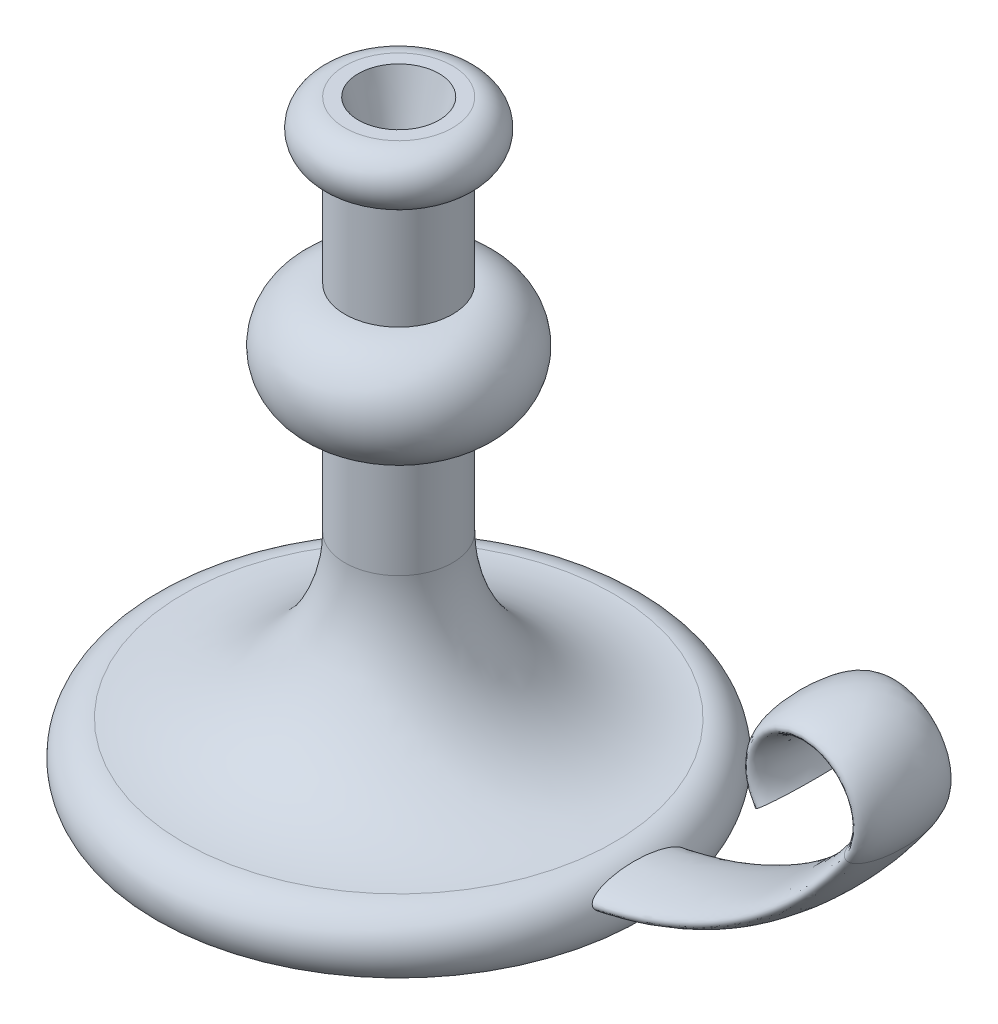
ISO-10303-21;
HEADER;
FILE_DESCRIPTION(('STEP AP214'),'2;1');
FILE_NAME('part.step','',(''),(''),'','','');
FILE_SCHEMA(('AUTOMOTIVE_DESIGN { 1 0 10303 214 1 1 1 1 }'));
ENDSEC;
DATA;
#1=APPLICATION_CONTEXT('core data for automotive mechanical design processes');
#2=APPLICATION_PROTOCOL_DEFINITION('international standard','automotive_design',2000,#1);
#3=PRODUCT_CONTEXT('',#1,'mechanical');
#4=PRODUCT('Part','Part','',(#3));
#5=PRODUCT_RELATED_PRODUCT_CATEGORY('part','',(#4));
#6=PRODUCT_DEFINITION_FORMATION('','',#4);
#7=PRODUCT_DEFINITION_CONTEXT('part definition',#1,'design');
#8=PRODUCT_DEFINITION('design','',#6,#7);
#9=PRODUCT_DEFINITION_SHAPE('','',#8);
#10=(LENGTH_UNIT() NAMED_UNIT(*) SI_UNIT(.MILLI.,.METRE.));
#11=(NAMED_UNIT(*) PLANE_ANGLE_UNIT() SI_UNIT($,.RADIAN.));
#12=(NAMED_UNIT(*) SI_UNIT($,.STERADIAN.) SOLID_ANGLE_UNIT());
#13=UNCERTAINTY_MEASURE_WITH_UNIT(LENGTH_MEASURE(1.E-05),#10,'distance_accuracy_value','');
#14=(GEOMETRIC_REPRESENTATION_CONTEXT(3) GLOBAL_UNCERTAINTY_ASSIGNED_CONTEXT((#13)) GLOBAL_UNIT_ASSIGNED_CONTEXT((#10,
#11,#12)) REPRESENTATION_CONTEXT('',''));
#15=CARTESIAN_POINT('',(0.,0.,0.));
#16=DIRECTION('',(0.,0.,1.));
#17=DIRECTION('',(1.,0.,0.));
#18=AXIS2_PLACEMENT_3D('',#15,#16,#17);
#19=CARTESIAN_POINT('',(0.,0.,0.));
#20=DIRECTION('',(0.,-1.,0.));
#21=DIRECTION('',(0.,0.,-1.));
#22=AXIS2_PLACEMENT_3D('',#19,#20,#21);
#23=PLANE('',#22);
#24=CARTESIAN_POINT('',(0.,0.,0.));
#25=DIRECTION('',(0.,-1.,0.));
#26=DIRECTION('',(0.,0.,-1.));
#27=AXIS2_PLACEMENT_3D('',#24,#25,#26);
#28=CIRCLE('',#27,90.);
#29=CARTESIAN_POINT('',(0.,0.,-90.));
#30=VERTEX_POINT('',#29);
#31=EDGE_CURVE('E77',#30,#30,#28,.T.);
#32=ORIENTED_EDGE('',*,*,#31,.T.);
#33=EDGE_LOOP('',(#32));
#34=FACE_BOUND('',#33,.T.);
#35=ADVANCED_FACE('F37',(#34),#23,.T.);
#36=CARTESIAN_POINT('',(0.,220.,0.));
#37=DIRECTION('',(0.,1.,0.));
#38=DIRECTION('',(0.,0.,1.));
#39=AXIS2_PLACEMENT_3D('',#36,#37,#38);
#40=PLANE('',#39);
#41=CARTESIAN_POINT('',(0.,220.,0.));
#42=DIRECTION('',(0.,1.,0.));
#43=DIRECTION('',(0.,0.,1.));
#44=AXIS2_PLACEMENT_3D('',#41,#42,#43);
#45=CIRCLE('',#44,15.);
#46=CARTESIAN_POINT('',(0.,220.,15.));
#47=VERTEX_POINT('',#46);
#48=EDGE_CURVE('E93',#47,#47,#45,.T.);
#49=ORIENTED_EDGE('',*,*,#48,.F.);
#50=EDGE_LOOP('',(#49));
#51=FACE_BOUND('',#50,.T.);
#52=CARTESIAN_POINT('',(0.,220.,0.));
#53=DIRECTION('',(0.,-1.,0.));
#54=DIRECTION('',(0.,0.,-1.));
#55=AXIS2_PLACEMENT_3D('',#52,#53,#54);
#56=CIRCLE('',#55,20.);
#57=CARTESIAN_POINT('',(0.,220.,-20.));
#58=VERTEX_POINT('',#57);
#59=EDGE_CURVE('E49',#58,#58,#56,.T.);
#60=ORIENTED_EDGE('',*,*,#59,.F.);
#61=EDGE_LOOP('',(#60));
#62=FACE_BOUND('',#61,.T.);
#63=ADVANCED_FACE('F100',(#51,#62),#40,.T.);
#64=CARTESIAN_POINT('',(0.,210.,0.));
#65=DIRECTION('',(0.,-1.,0.));
#66=DIRECTION('',(0.,0.,-1.));
#67=AXIS2_PLACEMENT_3D('',#64,#65,#66);
#68=TOROIDAL_SURFACE('',#67,20.,10.);
#69=ORIENTED_EDGE('',*,*,#59,.T.);
#70=EDGE_LOOP('',(#69));
#71=FACE_BOUND('',#70,.T.);
#72=CARTESIAN_POINT('',(0.,200.,0.));
#73=DIRECTION('',(0.,-1.,0.));
#74=DIRECTION('',(0.,0.,-1.));
#75=AXIS2_PLACEMENT_3D('',#72,#73,#74);
#76=CIRCLE('',#75,20.);
#77=CARTESIAN_POINT('',(0.,200.,-20.));
#78=VERTEX_POINT('',#77);
#79=EDGE_CURVE('E54',#78,#78,#76,.T.);
#80=ORIENTED_EDGE('',*,*,#79,.F.);
#81=EDGE_LOOP('',(#80));
#82=FACE_BOUND('',#81,.T.);
#83=ADVANCED_FACE('F103',(#71,#82),#68,.T.);
#84=CARTESIAN_POINT('',(0.,0.,0.));
#85=DIRECTION('',(0.,-1.,0.));
#86=DIRECTION('',(0.,0.,-1.));
#87=AXIS2_PLACEMENT_3D('',#84,#85,#86);
#88=CYLINDRICAL_SURFACE('',#87,20.);
#89=ORIENTED_EDGE('',*,*,#79,.T.);
#90=EDGE_LOOP('',(#89));
#91=FACE_BOUND('',#90,.T.);
#92=CARTESIAN_POINT('',(0.,160.,0.));
#93=DIRECTION('',(0.,-1.,0.));
#94=DIRECTION('',(0.,0.,-1.));
#95=AXIS2_PLACEMENT_3D('',#92,#93,#94);
#96=CIRCLE('',#95,20.);
#97=CARTESIAN_POINT('',(0.,160.,-20.));
#98=VERTEX_POINT('',#97);
#99=EDGE_CURVE('E59',#98,#98,#96,.T.);
#100=ORIENTED_EDGE('',*,*,#99,.F.);
#101=EDGE_LOOP('',(#100));
#102=FACE_BOUND('',#101,.T.);
#103=ADVANCED_FACE('F109',(#91,#102),#88,.T.);
#104=CARTESIAN_POINT('',(0.,140.,0.));
#105=DIRECTION('',(0.,-1.,0.));
#106=DIRECTION('',(0.,0.,-1.));
#107=AXIS2_PLACEMENT_3D('',#104,#105,#106);
#108=TOROIDAL_SURFACE('',#107,20.,20.);
#109=ORIENTED_EDGE('',*,*,#99,.T.);
#110=EDGE_LOOP('',(#109));
#111=FACE_BOUND('',#110,.T.);
#112=CARTESIAN_POINT('',(0.,120.,0.));
#113=DIRECTION('',(0.,-1.,0.));
#114=DIRECTION('',(0.,0.,-1.));
#115=AXIS2_PLACEMENT_3D('',#112,#113,#114);
#116=CIRCLE('',#115,20.);
#117=CARTESIAN_POINT('',(0.,120.,-20.));
#118=VERTEX_POINT('',#117);
#119=EDGE_CURVE('E65',#118,#118,#116,.T.);
#120=ORIENTED_EDGE('',*,*,#119,.F.);
#121=EDGE_LOOP('',(#120));
#122=FACE_BOUND('',#121,.T.);
#123=ADVANCED_FACE('F116',(#111,#122),#108,.T.);
#124=CARTESIAN_POINT('',(0.,0.,0.));
#125=DIRECTION('',(0.,-1.,0.));
#126=DIRECTION('',(0.,0.,-1.));
#127=AXIS2_PLACEMENT_3D('',#124,#125,#126);
#128=CYLINDRICAL_SURFACE('',#127,20.);
#129=ORIENTED_EDGE('',*,*,#119,.T.);
#130=EDGE_LOOP('',(#129));
#131=FACE_BOUND('',#130,.T.);
#132=CARTESIAN_POINT('',(0.,80.,0.));
#133=DIRECTION('',(0.,-1.,0.));
#134=DIRECTION('',(0.,0.,-1.));
#135=AXIS2_PLACEMENT_3D('',#132,#133,#134);
#136=CIRCLE('',#135,20.);
#137=CARTESIAN_POINT('',(0.,80.,-20.));
#138=VERTEX_POINT('',#137);
#139=EDGE_CURVE('E69',#138,#138,#136,.T.);
#140=ORIENTED_EDGE('',*,*,#139,.F.);
#141=EDGE_LOOP('',(#140));
#142=FACE_BOUND('',#141,.T.);
#143=ADVANCED_FACE('F120',(#131,#142),#128,.T.);
#144=CARTESIAN_POINT('',(0.,80.,0.));
#145=DIRECTION('',(0.,-1.,0.));
#146=DIRECTION('',(0.,0.,-1.));
#147=AXIS2_PLACEMENT_3D('',#144,#145,#146);
#148=TOROIDAL_SURFACE('',#147,80.,60.);
#149=ORIENTED_EDGE('',*,*,#139,.T.);
#150=EDGE_LOOP('',(#149));
#151=FACE_BOUND('',#150,.T.);
#152=CARTESIAN_POINT('',(0.,20.,0.));
#153=DIRECTION('',(0.,-1.,0.));
#154=DIRECTION('',(0.,0.,-1.));
#155=AXIS2_PLACEMENT_3D('',#152,#153,#154);
#156=CIRCLE('',#155,80.);
#157=CARTESIAN_POINT('',(0.,20.,-80.));
#158=VERTEX_POINT('',#157);
#159=EDGE_CURVE('E73',#158,#158,#156,.T.);
#160=ORIENTED_EDGE('',*,*,#159,.F.);
#161=EDGE_LOOP('',(#160));
#162=FACE_BOUND('',#161,.T.);
#163=ADVANCED_FACE('F124',(#151,#162),#148,.F.);
#164=CARTESIAN_POINT('',(0.,7.49999999999999,0.));
#165=DIRECTION('',(0.,-1.,0.));
#166=DIRECTION('',(0.,0.,-1.));
#167=AXIS2_PLACEMENT_3D('',#164,#165,#166);
#168=TOROIDAL_SURFACE('',#167,80.,12.5);
#169=CARTESIAN_POINT('',(89.5597422043341,12.9414346567555,-17.5));
#170=CARTESIAN_POINT('',(89.5390618403561,12.9834100865229,-17.4999996776707));
#171=CARTESIAN_POINT('',(89.5184817634659,13.0254349004937,-17.4978446678338));
#172=CARTESIAN_POINT('',(89.4776811982743,13.1092324497794,-17.4892861575811));
#173=CARTESIAN_POINT('',(89.457460843071,13.1510050881611,-17.482881116885));
#174=CARTESIAN_POINT('',(89.397540281121,13.2754779151414,-17.4575154450277));
#175=CARTESIAN_POINT('',(89.3585808220613,13.357332519418,-17.4324042670615));
#176=CARTESIAN_POINT('',(89.2734407804368,13.5379179993389,-17.3597430943198));
#177=CARTESIAN_POINT('',(89.2281116968574,13.6353152430682,-17.3079906529225));
#178=CARTESIAN_POINT('',(89.1421567137609,13.8217570109409,-17.1881654215547));
#179=CARTESIAN_POINT('',(89.10154096816,13.9107834263932,-17.1200583326704));
#180=CARTESIAN_POINT('',(89.0298799325304,14.0690063055582,-16.9825317839868));
#181=CARTESIAN_POINT('',(88.9982856031081,14.1392491335227,-16.9145677994464));
#182=CARTESIAN_POINT('',(88.9378435588022,14.2742914925202,-16.7722502997375));
#183=CARTESIAN_POINT('',(88.9089980734781,14.3390866000317,-16.6978916893925));
#184=CARTESIAN_POINT('',(88.8536099995593,14.4639626152392,-16.5442177801531));
#185=CARTESIAN_POINT('',(88.8270733532936,14.5240313225779,-16.4648905452803));
#186=CARTESIAN_POINT('',(88.7760376587063,14.6398576639347,-16.3025863942461));
#187=CARTESIAN_POINT('',(88.7515379613228,14.6956166708123,-16.219610653644));
#188=CARTESIAN_POINT('',(88.7047328205489,14.8023169553036,-16.052427362784));
#189=CARTESIAN_POINT('',(88.6823939519366,14.8533308765833,-15.9682752160745));
#190=CARTESIAN_POINT('',(88.639155365759,14.9521540950118,-15.7977416210759));
#191=CARTESIAN_POINT('',(88.6182558899721,14.9999628537458,-15.711359801597));
#192=CARTESIAN_POINT('',(88.5573681790008,15.1392585624723,-15.4492483073625));
#193=CARTESIAN_POINT('',(88.5192579811327,15.2264609786255,-15.2707999543232));
#194=CARTESIAN_POINT('',(88.4468979005836,15.3916731276291,-14.9088289385944));
#195=CARTESIAN_POINT('',(88.4126513155026,15.4696750103546,-14.725302105289));
#196=CARTESIAN_POINT('',(88.3471391595039,15.6182965032923,-14.3538259785736));
#197=CARTESIAN_POINT('',(88.3158872528146,15.6888824046966,-14.1658608782527));
#198=CARTESIAN_POINT('',(88.2560127035516,15.8233792512431,-13.7874003918539));
#199=CARTESIAN_POINT('',(88.2273872233002,15.8872974109117,-13.5969079973402));
#200=CARTESIAN_POINT('',(88.1723348827448,16.0094159388249,-13.213849673779));
#201=CARTESIAN_POINT('',(88.1459074726896,16.0676177374301,-13.021284276893));
#202=CARTESIAN_POINT('',(88.0884248304702,16.1932687928886,-12.5849658119247));
#203=CARTESIAN_POINT('',(88.0579162002184,16.2592725226906,-12.3407253521734));
#204=CARTESIAN_POINT('',(87.9994625659013,16.3844358500305,-11.8501803460781));
#205=CARTESIAN_POINT('',(87.9715178234088,16.4435947494061,-11.6038755919222));
#206=CARTESIAN_POINT('',(87.9178897421858,16.5558889779776,-11.1095299870479));
#207=CARTESIAN_POINT('',(87.8922075114269,16.6090213595568,-10.8614883492399));
#208=CARTESIAN_POINT('',(87.8429155378603,16.7098546386226,-10.3640943607017));
#209=CARTESIAN_POINT('',(87.8193058942812,16.7575552760879,-10.114741947821));
#210=CARTESIAN_POINT('',(87.7514718906047,16.8930622945828,-9.36631396644898));
#211=CARTESIAN_POINT('',(87.710111419914,16.97354616682,-8.86564202060312));
#212=CARTESIAN_POINT('',(87.6344118706353,17.1178657179368,-7.86153551840227));
#213=CARTESIAN_POINT('',(87.6000713341079,17.1817048544489,-7.35810155802563));
#214=CARTESIAN_POINT('',(87.5383679228554,17.2943697092708,-6.35225136111873));
#215=CARTESIAN_POINT('',(87.5109639050818,17.3432843238913,-5.84984753787555));
#216=CARTESIAN_POINT('',(87.4628391630611,17.4279603163538,-4.84354228831009));
#217=CARTESIAN_POINT('',(87.4421195253372,17.4637195559667,-4.33964063194089));
#218=CARTESIAN_POINT('',(87.4074386787954,17.5229738360405,-3.33084363886012));
#219=CARTESIAN_POINT('',(87.3934780874881,17.5464677559495,-2.8259482155868));
#220=CARTESIAN_POINT('',(87.3724154174235,17.5817273168609,-1.81615213380802));
#221=CARTESIAN_POINT('',(87.3653059747339,17.5935055508652,-1.31125206554519));
#222=CARTESIAN_POINT('',(87.3579750479624,17.6056484066489,-0.301318309132898));
#223=CARTESIAN_POINT('',(87.357752858235,17.6060141977103,0.203715360026102));
#224=CARTESIAN_POINT('',(87.3641963426438,17.5953454261038,1.2135672655417));
#225=CARTESIAN_POINT('',(87.3708612610896,17.5843121142068,1.7183855194551));
#226=CARTESIAN_POINT('',(87.3886163883338,17.554616306541,2.60695068649854));
#227=CARTESIAN_POINT('',(87.3982690399213,17.5384060734754,2.9908104647884));
#228=CARTESIAN_POINT('',(87.4214966880659,17.4990063104014,3.75807002785712));
#229=CARTESIAN_POINT('',(87.435071823598,17.4758165331044,4.14146979585428));
#230=CARTESIAN_POINT('',(87.4661109016121,17.4221255760208,4.90767543763209));
#231=CARTESIAN_POINT('',(87.4835755913649,17.3916229911934,5.29048118303759));
#232=CARTESIAN_POINT('',(87.52247652696,17.3226675403927,6.05728766608036));
#233=CARTESIAN_POINT('',(87.5439339089184,17.2841722314846,6.44128353835441));
#234=CARTESIAN_POINT('',(87.5907685418077,17.1987228636429,7.20803081067556));
#235=CARTESIAN_POINT('',(87.6161451191905,17.1517702579396,7.5907824130423));
#236=CARTESIAN_POINT('',(87.6708875244928,17.0486132676472,8.35453102594114));
#237=CARTESIAN_POINT('',(87.7002509792863,16.9924143825779,8.73552894189135));
#238=CARTESIAN_POINT('',(87.7555693385741,16.8844873931684,9.40362807317344));
#239=CARTESIAN_POINT('',(87.7806318626291,16.8349635590468,9.6911595586556));
#240=CARTESIAN_POINT('',(87.8333287645207,16.7293167465828,10.2648242071223));
#241=CARTESIAN_POINT('',(87.8609635304672,16.6731927720484,10.5509571522122));
#242=CARTESIAN_POINT('',(87.9190678138249,16.5534902310351,11.1217112831612));
#243=CARTESIAN_POINT('',(87.9495404231884,16.4899035134826,11.4063304543324));
#244=CARTESIAN_POINT('',(88.0137266324375,16.3541216812727,11.9738772339476));
#245=CARTESIAN_POINT('',(88.0474477220507,16.2819065762202,12.2567992545898));
#246=CARTESIAN_POINT('',(88.1183718381953,16.1280994435204,12.8175821097588));
#247=CARTESIAN_POINT('',(88.1555499028383,16.046573796357,13.0954641920682));
#248=CARTESIAN_POINT('',(88.2343580118385,15.8719007074313,13.6468218234687));
#249=CARTESIAN_POINT('',(88.2759857295858,15.7787593350285,13.9202995902182));
#250=CARTESIAN_POINT('',(88.3426568223939,15.628384040649,14.3254052817092));
#251=CARTESIAN_POINT('',(88.3655500017785,15.5765627213432,14.459402316928));
#252=CARTESIAN_POINT('',(88.4129882653633,15.4688611687535,14.7254525655375));
#253=CARTESIAN_POINT('',(88.437533168995,15.4129813790936,14.8575059894887));
#254=CARTESIAN_POINT('',(88.4884967907572,15.296726972035,15.1188747284343));
#255=CARTESIAN_POINT('',(88.5149109123158,15.2363633637366,15.2481958098579));
#256=CARTESIAN_POINT('',(88.5700241751771,15.1103179001212,15.5037035642081));
#257=CARTESIAN_POINT('',(88.5987227483177,15.0446373670989,15.6298910063173));
#258=CARTESIAN_POINT('',(88.6570151826478,14.9113179601609,15.8704199707059));
#259=CARTESIAN_POINT('',(88.686441736786,14.8440563407289,15.985009599526));
#260=CARTESIAN_POINT('',(88.7482816567768,14.7030103830827,16.2094581395952));
#261=CARTESIAN_POINT('',(88.7806974756141,14.6292206899981,16.3193130551169));
#262=CARTESIAN_POINT('',(88.8489097184972,14.4745639616531,16.5315146626623));
#263=CARTESIAN_POINT('',(88.8846785573508,14.3937550191611,16.6339121024916));
#264=CARTESIAN_POINT('',(88.9606113704153,14.2232561160767,16.8291907541922));
#265=CARTESIAN_POINT('',(89.0007675950253,14.1335818404865,16.9220882016582));
#266=CARTESIAN_POINT('',(89.0601235459873,14.0021924630805,17.0411637727684));
#267=CARTESIAN_POINT('',(89.0770574086405,13.9648250339927,17.0732949178269));
#268=CARTESIAN_POINT('',(89.1117704043089,13.8885105828123,17.1351129203988));
#269=CARTESIAN_POINT('',(89.1295494801998,13.8495636674962,17.1647999427301));
#270=CARTESIAN_POINT('',(89.1842722230347,13.7301865324198,17.2496672583031));
#271=CARTESIAN_POINT('',(89.2225929343975,13.6472387371287,17.3006362954167));
#272=CARTESIAN_POINT('',(89.2830198855204,13.5177923286577,17.3659392171784));
#273=CARTESIAN_POINT('',(89.3038035106325,13.4734899832391,17.385944655127));
#274=CARTESIAN_POINT('',(89.346235727213,13.3835498526412,17.421521231844));
#275=CARTESIAN_POINT('',(89.3678838017236,13.3379128698458,17.4370949768747));
#276=CARTESIAN_POINT('',(89.411904802424,13.2456714845448,17.4633118273199));
#277=CARTESIAN_POINT('',(89.4342765183816,13.1990687398024,17.4739627514632));
#278=CARTESIAN_POINT('',(89.4796070415906,13.1052444737537,17.4900003628641));
#279=CARTESIAN_POINT('',(89.5025657624808,13.0580230439623,17.495387819971));
#280=CARTESIAN_POINT('',(89.5464271716018,12.9684112208445,17.5004320668286));
#281=CARTESIAN_POINT('',(89.5672934245651,12.9260327119426,17.5006298436876));
#282=CARTESIAN_POINT('',(89.6091580078856,12.8415284156484,17.496667300483));
#283=CARTESIAN_POINT('',(89.6301563797468,12.7994027167221,17.4925055351934));
#284=CARTESIAN_POINT('',(89.672115635143,12.7157496198108,17.479965082583));
#285=CARTESIAN_POINT('',(89.6930765014329,12.6742224548789,17.4715847960014));
#286=CARTESIAN_POINT('',(89.7348115258834,12.5920532516239,17.4508625220261));
#287=CARTESIAN_POINT('',(89.755585576578,12.5514117057388,17.4385183877269));
#288=CARTESIAN_POINT('',(89.8013847331776,12.4623676182577,17.407062698976));
#289=CARTESIAN_POINT('',(89.8263321178974,12.4142402057079,17.3870577635768));
#290=CARTESIAN_POINT('',(89.8756026524762,12.319894282953,17.3423007335128));
#291=CARTESIAN_POINT('',(89.8999253272692,12.2736772101064,17.317545140678));
#292=CARTESIAN_POINT('',(89.9718636752115,12.1379719567039,17.2371059859825));
#293=CARTESIAN_POINT('',(90.0184026508768,12.051520920799,17.1752845379973));
#294=CARTESIAN_POINT('',(90.1015176697338,11.8991704299987,17.0502729237445));
#295=CARTESIAN_POINT('',(90.1385373685485,11.832138329749,16.9886971231214));
#296=CARTESIAN_POINT('',(90.2104869329279,11.7032426034952,16.8591573255863));
#297=CARTESIAN_POINT('',(90.2454151408799,11.641383062009,16.7911883686367));
#298=CARTESIAN_POINT('',(90.3133841124365,11.5222099067343,16.6502911436158));
#299=CARTESIAN_POINT('',(90.3464212107125,11.4649050425001,16.5773538074551));
#300=CARTESIAN_POINT('',(90.4107258034174,11.3544143267813,16.427734996584));
#301=CARTESIAN_POINT('',(90.4419937497578,11.3012274221163,16.3510544874358));
#302=CARTESIAN_POINT('',(90.5066142435687,11.1922810586096,16.185318952537));
#303=CARTESIAN_POINT('',(90.5397652495638,11.1369814833086,16.0958847835332));
#304=CARTESIAN_POINT('',(90.6043042941241,11.0303194621558,15.9140859303206));
#305=CARTESIAN_POINT('',(90.6356921559875,10.978957410734,15.8217209538336));
#306=CARTESIAN_POINT('',(90.696838387797,10.8797698841651,15.6347974994414));
#307=CARTESIAN_POINT('',(90.7265992701636,10.8319389137698,15.5402427441421));
#308=CARTESIAN_POINT('',(90.7846969346251,10.7393295137681,15.3492353522606));
#309=CARTESIAN_POINT('',(90.8130337948203,10.6945509167067,15.2527828201665));
#310=CARTESIAN_POINT('',(90.8771212205238,10.5940589597549,15.0277319837684));
#311=CARTESIAN_POINT('',(90.9124022819657,10.5393328792866,14.8985593440142));
#312=CARTESIAN_POINT('',(90.9809741103801,10.4339610325184,14.638032843261));
#313=CARTESIAN_POINT('',(91.0142645951402,10.3833158444318,14.5066786763349));
#314=CARTESIAN_POINT('',(91.1115171918212,10.2366440116077,14.1096810918782));
#315=CARTESIAN_POINT('',(91.1727828792965,10.1460018602115,13.841380042592));
#316=CARTESIAN_POINT('',(91.2892862812459,9.97615455726919,13.299790663846));
#317=CARTESIAN_POINT('',(91.3445203789087,9.89695625887042,13.0264994554538));
#318=CARTESIAN_POINT('',(91.4499805719979,9.74769654866271,12.474859415595));
#319=CARTESIAN_POINT('',(91.5001780442571,9.67768673078024,12.19649125367));
#320=CARTESIAN_POINT('',(91.5957501918067,9.54592534416394,11.6372393425746));
#321=CARTESIAN_POINT('',(91.6411285723793,9.48416742117636,11.3563577087908));
#322=CARTESIAN_POINT('',(91.7275132616963,9.36779787162555,10.7925089006679));
#323=CARTESIAN_POINT('',(91.7685202729419,9.31318509647931,10.5095420692685));
#324=CARTESIAN_POINT('',(91.8503345045436,9.20520508711813,9.91387150213629));
#325=CARTESIAN_POINT('',(91.8907217744487,9.15249390095819,9.6009916832361));
#326=CARTESIAN_POINT('',(91.9669218199108,9.05389158705539,8.97359688181946));
#327=CARTESIAN_POINT('',(92.0027343661629,9.00800080116145,8.65908181815922));
#328=CARTESIAN_POINT('',(92.07003298894,8.92240020575313,8.02865568808758));
#329=CARTESIAN_POINT('',(92.1015177516248,8.88269227276201,7.71274422766474));
#330=CARTESIAN_POINT('',(92.1603325838502,8.80898713679311,7.07986626810593));
#331=CARTESIAN_POINT('',(92.1876625005418,8.77499014390506,6.76289973059382));
#332=CARTESIAN_POINT('',(92.263503001365,8.68114273902103,5.81249868362221));
#333=CARTESIAN_POINT('',(92.3060517448552,8.62919999492196,5.17778747193847));
#334=CARTESIAN_POINT('',(92.3760091017524,8.54431318450693,3.9062793818683));
#335=CARTESIAN_POINT('',(92.4034169750228,8.51137004695191,3.26948240305295));
#336=CARTESIAN_POINT('',(92.4435085691828,8.46331702284121,1.99545741778455));
#337=CARTESIAN_POINT('',(92.4562084043365,8.44818761908848,1.35823064985432));
#338=CARTESIAN_POINT('',(92.4671302630246,8.43517103988552,0.0834423270817006));
#339=CARTESIAN_POINT('',(92.4653514271759,8.43728488791031,-0.554119245387144));
#340=CARTESIAN_POINT('',(92.4472853754493,8.45883344750919,-1.82886328296891));
#341=CARTESIAN_POINT('',(92.4309954438924,8.47827140120324,-2.46604565478002));
#342=CARTESIAN_POINT('',(92.3836590626409,8.53514174464787,-3.73902583866906));
#343=CARTESIAN_POINT('',(92.3526140808132,8.57257234445212,-4.37482378215404));
#344=CARTESIAN_POINT('',(92.2921790866404,8.64621329194986,-5.36625544460879));
#345=CARTESIAN_POINT('',(92.2680118235609,8.6757873696347,-5.72271555901768));
#346=CARTESIAN_POINT('',(92.2147013952356,8.7414640473538,-6.43465819603203));
#347=CARTESIAN_POINT('',(92.1855583836334,8.77756644580526,-6.79014074847885));
#348=CARTESIAN_POINT('',(92.1221127048894,8.85679311513338,-7.4998383605939));
#349=CARTESIAN_POINT('',(92.0878103957549,8.8999168988081,-7.85405350646374));
#350=CARTESIAN_POINT('',(92.0137981226251,8.99384143269637,-8.56089767223832));
#351=CARTESIAN_POINT('',(91.9740883343959,9.04464193338968,-8.91352674331258));
#352=CARTESIAN_POINT('',(91.9015818240065,9.13842562293704,-9.51226790233034));
#353=CARTESIAN_POINT('',(91.8702370654072,9.17924629619422,-9.75889575934122));
#354=CARTESIAN_POINT('',(91.8045624920058,9.26550036635897,-10.2509419620295));
#355=CARTESIAN_POINT('',(91.7702327567071,9.31093364041754,-10.4963603397369));
#356=CARTESIAN_POINT('',(91.6984266463272,9.40685898724866,-10.9855805665729));
#357=CARTESIAN_POINT('',(91.6609523533817,9.4573477168195,-11.229383371816));
#358=CARTESIAN_POINT('',(91.5826038967893,9.5640131709901,-11.7151775621042));
#359=CARTESIAN_POINT('',(91.5417298772537,9.62018965451299,-11.9571690234569));
#360=CARTESIAN_POINT('',(91.4386423376747,9.76351210996369,-12.5384162018479));
#361=CARTESIAN_POINT('',(91.3745858903289,9.85386844470731,-12.8765786557767));
#362=CARTESIAN_POINT('',(91.2720163238267,10.0014015523805,-13.3793136041307));
#363=CARTESIAN_POINT('',(91.2367090969993,10.0526332971692,-13.5462966135003));
#364=CARTESIAN_POINT('',(91.1637294936458,10.1596261841617,-13.8782853379551));
#365=CARTESIAN_POINT('',(91.1260572231722,10.2153871233018,-14.043291141307));
#366=CARTESIAN_POINT('',(91.0448513753998,10.3369382727867,-14.3844416693125));
#367=CARTESIAN_POINT('',(91.0010908407916,10.4031767890597,-14.5603739146111));
#368=CARTESIAN_POINT('',(90.9100440331646,10.5428509324197,-14.9085311659828));
#369=CARTESIAN_POINT('',(90.8627565865346,10.6162889577862,-15.0807549132311));
#370=CARTESIAN_POINT('',(90.7642492199855,10.771565197048,-15.4195496037301));
#371=CARTESIAN_POINT('',(90.7130423069867,10.8533759065567,-15.5861368065582));
#372=CARTESIAN_POINT('',(90.6058220172113,11.0275348916428,-15.9120386126947));
#373=CARTESIAN_POINT('',(90.5498128203452,11.1198740259079,-16.0713593593322));
#374=CARTESIAN_POINT('',(90.4444082893051,11.296925592034,-16.3465910082039));
#375=CARTESIAN_POINT('',(90.3961277047705,11.3791055101424,-16.4645448336188));
#376=CARTESIAN_POINT('',(90.2950977924848,11.5538633486866,-16.691156614655));
#377=CARTESIAN_POINT('',(90.2423390562531,11.6464633011952,-16.7997939840166));
#378=CARTESIAN_POINT('',(90.1590440243456,11.7953014200272,-16.9524870890685));
#379=CARTESIAN_POINT('',(90.1303607600848,11.8469859215396,-17.001997718978));
#380=CARTESIAN_POINT('',(90.0716181087375,11.9538274561509,-17.0963102611099));
#381=CARTESIAN_POINT('',(90.0415584049395,12.0089852895523,-17.1411110817339));
#382=CARTESIAN_POINT('',(89.9801756575596,12.1227246632089,-17.2246441347398));
#383=CARTESIAN_POINT('',(89.9488577537651,12.1812926416248,-17.2633984155372));
#384=CARTESIAN_POINT('',(89.8849549671329,12.3020144005061,-17.3335784406431));
#385=CARTESIAN_POINT('',(89.8523712452274,12.3641649194654,-17.3650107233704));
#386=CARTESIAN_POINT('',(89.7981176909034,12.4687258013535,-17.4092508881815));
#387=CARTESIAN_POINT('',(89.7767436177655,12.5101841078545,-17.4246893204628));
#388=CARTESIAN_POINT('',(89.7336969050675,12.5942336377177,-17.4515182330193));
#389=CARTESIAN_POINT('',(89.7120243813912,12.6368244270179,-17.4629102408532));
#390=CARTESIAN_POINT('',(89.6685521390583,12.7228207531291,-17.4812886417918));
#391=CARTESIAN_POINT('',(89.6467526103346,12.766225219827,-17.488280453409));
#392=CARTESIAN_POINT('',(89.6031794397246,12.8535466229688,-17.4976362320133));
#393=CARTESIAN_POINT('',(89.5814057970822,12.8974635440192,-17.5000003376542));
#394=CARTESIAN_POINT('',(89.5597422043341,12.9414346567555,-17.5));
#395=B_SPLINE_CURVE_WITH_KNOTS('',3,(#169,#170,#171,#172,#173,#174,#175,#176,#177,#178,#179,
#180,#181,#182,#183,#184,#185,#186,#187,#188,#189,#190,#191,#192,#193,#194,#195,#196,#197,#198,
#199,#200,#201,#202,#203,#204,#205,#206,#207,#208,#209,#210,#211,#212,#213,#214,#215,#216,#217,
#218,#219,#220,#221,#222,#223,#224,#225,#226,#227,#228,#229,#230,#231,#232,#233,#234,#235,#236,
#237,#238,#239,#240,#241,#242,#243,#244,#245,#246,#247,#248,#249,#250,#251,#252,#253,#254,#255,
#256,#257,#258,#259,#260,#261,#262,#263,#264,#265,#266,#267,#268,#269,#270,#271,#272,#273,#274,
#275,#276,#277,#278,#279,#280,#281,#282,#283,#284,#285,#286,#287,#288,#289,#290,#291,#292,#293,
#294,#295,#296,#297,#298,#299,#300,#301,#302,#303,#304,#305,#306,#307,#308,#309,#310,#311,#312,
#313,#314,#315,#316,#317,#318,#319,#320,#321,#322,#323,#324,#325,#326,#327,#328,#329,#330,#331,
#332,#333,#334,#335,#336,#337,#338,#339,#340,#341,#342,#343,#344,#345,#346,#347,#348,#349,#350,
#351,#352,#353,#354,#355,#356,#357,#358,#359,#360,#361,#362,#363,#364,#365,#366,#367,#368,#369,
#370,#371,#372,#373,#374,#375,#376,#377,#378,#379,#380,#381,#382,#383,#384,#385,#386,#387,#388,
#389,#390,#391,#392,#393,#394),.UNSPECIFIED.,.T.,.F.,(4,2,2,2,2,2,2,2,2,2,2,2,2,2,2,2,2,2,2,2,2,
2,2,2,2,2,2,2,2,2,2,2,2,2,2,2,2,2,2,2,2,2,2,2,2,2,2,2,2,2,2,2,2,2,2,2,2,2,2,2,2,2,2,2,2,2,2,2,2,
2,2,2,2,2,2,2,2,2,2,2,2,2,2,2,2,2,2,2,2,2,2,2,2,2,2,2,2,2,2,2,2,2,2,2,2,2,2,2,2,2,2,2,4),(0.,
0.140326879649323,0.280704643844317,0.561461806499951,0.917225717585817,1.27374235386085,
1.58146302398148,1.88943119593643,2.19816989275476,2.50680983170027,2.80944292372751,
3.11212672643258,3.71838915770195,4.32516518168248,4.93458970782545,5.54334784093538,
6.15195325906649,6.91631911029046,7.68076285707088,8.44557890144727,9.21043154271131,
10.7363530227227,12.2619572680851,13.7782885580523,15.2948661984783,16.8115823682402,
18.3266664767785,19.8415953542036,21.3563580231468,22.5092504482308,23.6621837256808,
24.8153386988898,25.9747813799631,27.1340250219354,28.2925816429425,29.1710242088838,
30.0495995331114,30.9291435591542,31.8107663507034,32.6864555684207,33.5616891298975,
33.9980703124477,34.4344038665402,34.8696994156046,35.3048870393029,35.7129485465613,
36.1213479397352,36.5266413619584,36.9312301321629,37.087481072601,37.2437214677037,
37.5562829439449,37.7147148343191,37.8730533580126,38.0311395270883,38.1892025705741,
38.3307149014328,38.4722741597123,38.6138871242241,38.7555769191151,38.9286541005773,
39.1018592207181,39.4485901352339,39.7429975955386,40.0376353818191,40.3328261359407,
40.6279411430422,40.9585479808934,41.2891878931729,41.6193018978015,41.9493977775689,
42.3832551508598,42.8171738887968,43.6859467918766,44.5552378220699,45.429218266336,
46.3025217875277,47.1756847521808,48.1351081860329,49.0945796914519,50.0543418354858,
51.014139278793,52.9283366636007,54.842627612508,56.7548192562807,58.6671243992158,
60.5797874956858,62.492260355769,63.5676819321842,64.6430703071868,65.7183840946021,
66.7936629380619,67.5494303160598,68.3051775707186,69.0604283053772,69.8156470419349,
70.8826765887348,71.4172057561795,71.9517109715326,72.5305894861724,73.1096614946431,
73.6868888443991,74.2636187787011,74.7180950553374,75.1735510009088,75.4046853668801,
75.6358731855895,75.8661972266865,76.0963147970917,76.2435550398534,76.3907396389802,
76.5377426347989,76.6847412260987),.UNSPECIFIED.);
#396=CARTESIAN_POINT('',(89.5597422043341,12.9414346567555,-17.5));
#397=VERTEX_POINT('',#396);
#398=EDGE_CURVE('E10',#397,#397,#395,.T.);
#399=ORIENTED_EDGE('',*,*,#398,.F.);
#400=EDGE_LOOP('',(#399));
#401=FACE_BOUND('',#400,.T.);
#402=ORIENTED_EDGE('',*,*,#159,.T.);
#403=EDGE_LOOP('',(#402));
#404=FACE_BOUND('',#403,.T.);
#405=ORIENTED_EDGE('',*,*,#31,.F.);
#406=EDGE_LOOP('',(#405));
#407=FACE_BOUND('',#406,.T.);
#408=ADVANCED_FACE('F127',(#401,#404,#407),#168,.T.);
#409=CARTESIAN_POINT('',(150.634185358261,75.,0.));
#410=DIRECTION('',(0.566666666666666,-0.823947139620552,0.));
#411=DIRECTION('',(0.,0.,-1.));
#412=AXIS2_PLACEMENT_3D('',#409,#410,#411);
#413=PLANE('',#412);
#414=CARTESIAN_POINT('',(150.634185358261,75.,0.));
#415=DIRECTION('',(0.566666666666666,-0.823947139620552,0.));
#416=DIRECTION('',(0.,0.,-1.));
#417=AXIS2_PLACEMENT_3D('',#414,#415,#416);
#418=ELLIPSE('',#417,17.5,5.);
#419=CARTESIAN_POINT('',(150.634185358261,75.,-17.5));
#420=VERTEX_POINT('',#419);
#421=EDGE_CURVE('E81',#420,#420,#418,.T.);
#422=ORIENTED_EDGE('',*,*,#421,.T.);
#423=EDGE_LOOP('',(#422));
#424=FACE_BOUND('',#423,.T.);
#425=ADVANCED_FACE('F132',(#424),#413,.T.);
#426=CARTESIAN_POINT('',(60.,10.,-17.5));
#427=CARTESIAN_POINT('',(110.410191303973,10.,-17.5));
#428=CARTESIAN_POINT('',(155.026295870831,33.4646670673665,-17.5));
#429=CARTESIAN_POINT('',(183.592070943083,75.,-17.5));
#430=CARTESIAN_POINT('',(60.,20.,-17.5));
#431=CARTESIAN_POINT('',(107.049511883708,20.,-17.5));
#432=CARTESIAN_POINT('',(148.691209479443,41.9003559295421,-17.5));
#433=CARTESIAN_POINT('',(175.352599546877,80.6666666666666,-17.5));
#434=CARTESIAN_POINT('',(60.,20.,17.5));
#435=CARTESIAN_POINT('',(107.049511883708,20.,17.5));
#436=CARTESIAN_POINT('',(148.691209479443,41.9003559295421,17.5));
#437=CARTESIAN_POINT('',(175.352599546877,80.6666666666666,17.5));
#438=CARTESIAN_POINT('',(60.,10.,17.5));
#439=CARTESIAN_POINT('',(110.410191303973,10.,17.5));
#440=CARTESIAN_POINT('',(155.026295870831,33.4646670673665,17.5));
#441=CARTESIAN_POINT('',(183.592070943083,75.,17.5));
#442=CARTESIAN_POINT('',(60.,0.,17.5));
#443=CARTESIAN_POINT('',(113.770870724238,0.,17.5));
#444=CARTESIAN_POINT('',(161.36138226222,25.0289782051909,17.5));
#445=CARTESIAN_POINT('',(191.831542339288,69.3333333333333,17.5));
#446=CARTESIAN_POINT('',(60.,0.,-17.5));
#447=CARTESIAN_POINT('',(113.770870724238,0.,-17.5));
#448=CARTESIAN_POINT('',(161.36138226222,25.0289782051909,-17.5));
#449=CARTESIAN_POINT('',(191.831542339288,69.3333333333333,-17.5));
#450=CARTESIAN_POINT('',(60.,10.,-17.5));
#451=CARTESIAN_POINT('',(110.410191303973,10.,-17.5));
#452=CARTESIAN_POINT('',(155.026295870831,33.4646670673665,-17.5));
#453=CARTESIAN_POINT('',(183.592070943083,75.,-17.5));
#454=(BOUNDED_SURFACE() B_SPLINE_SURFACE(3,3,((#426,#427,#428,#429),(#430,#431,#432,#433),(#434,
#435,#436,#437),(#438,#439,#440,#441),(#442,#443,#444,#445),(#446,#447,#448,#449),(#450,#451,
#452,#453)),.UNSPECIFIED.,.T.,.F.,.F.) B_SPLINE_SURFACE_WITH_KNOTS((4,3,4),(4,4),(0.,0.5,1.),
(0.,1.),.UNSPECIFIED.) GEOMETRIC_REPRESENTATION_ITEM() RATIONAL_B_SPLINE_SURFACE(((1.,
0.923374135437856,0.923374135437856,1.),(0.333333333333333,0.307791378479285,0.307791378479285,
0.333333333333333),(0.333333333333333,0.307791378479285,0.307791378479285,0.333333333333333),
(1.,0.923374135437856,0.923374135437856,1.),(0.333333333333333,0.307791378479285,
0.307791378479285,0.333333333333333),(0.333333333333333,0.307791378479285,0.307791378479285,
0.333333333333333),(1.,0.923374135437856,0.923374135437856,1.))) REPRESENTATION_ITEM('') SURFACE());
#455=CARTESIAN_POINT('',(183.592070943083,75.,0.));
#456=DIRECTION('',(0.566666666666667,0.823947139620552,0.));
#457=DIRECTION('',(0.,0.,-1.));
#458=AXIS2_PLACEMENT_3D('',#455,#456,#457);
#459=ELLIPSE('',#458,17.5,5.);
#460=CARTESIAN_POINT('',(183.592070943083,75.,-17.5));
#461=VERTEX_POINT('',#460);
#462=EDGE_CURVE('E85',#461,#461,#459,.T.);
#463=ORIENTED_EDGE('',*,*,#398,.T.);
#464=EDGE_LOOP('',(#463));
#465=FACE_BOUND('',#464,.T.);
#466=ORIENTED_EDGE('',*,*,#462,.F.);
#467=EDGE_LOOP('',(#466));
#468=FACE_BOUND('',#467,.T.);
#469=ADVANCED_FACE('F137',(#465,#468),#454,.T.);
#470=CARTESIAN_POINT('',(183.592070943083,75.,-17.5));
#471=CARTESIAN_POINT('',(193.981461744242,90.10642735238,-17.5));
#472=CARTESIAN_POINT('',(185.447347211541,106.333333333333,-17.5));
#473=CARTESIAN_POINT('',(167.113128150672,106.333333333333,-17.5));
#474=CARTESIAN_POINT('',(148.778909089802,106.333333333333,-17.5));
#475=CARTESIAN_POINT('',(140.244794557101,90.1064273523801,-17.5));
#476=CARTESIAN_POINT('',(150.634185358261,75.,-17.5));
#477=CARTESIAN_POINT('',(175.352599546877,80.6666666666667,-17.5));
#478=CARTESIAN_POINT('',(180.547294947457,88.2198803428567,-17.5));
#479=CARTESIAN_POINT('',(176.280237681107,96.3333333333333,-17.5));
#480=CARTESIAN_POINT('',(167.113128150672,96.3333333333333,-17.5));
#481=CARTESIAN_POINT('',(157.946018620237,96.3333333333333,-17.5));
#482=CARTESIAN_POINT('',(153.678961353887,88.2198803428567,-17.5));
#483=CARTESIAN_POINT('',(158.873656754466,80.6666666666667,-17.5));
#484=CARTESIAN_POINT('',(175.352599546877,80.6666666666667,17.5));
#485=CARTESIAN_POINT('',(180.547294947457,88.2198803428567,17.5));
#486=CARTESIAN_POINT('',(176.280237681107,96.3333333333333,17.5));
#487=CARTESIAN_POINT('',(167.113128150672,96.3333333333333,17.5));
#488=CARTESIAN_POINT('',(157.946018620237,96.3333333333333,17.5));
#489=CARTESIAN_POINT('',(153.678961353887,88.2198803428567,17.5));
#490=CARTESIAN_POINT('',(158.873656754466,80.6666666666667,17.5));
#491=CARTESIAN_POINT('',(183.592070943083,75.,17.5));
#492=CARTESIAN_POINT('',(193.981461744242,90.10642735238,17.5));
#493=CARTESIAN_POINT('',(185.447347211541,106.333333333333,17.5));
#494=CARTESIAN_POINT('',(167.113128150672,106.333333333333,17.5));
#495=CARTESIAN_POINT('',(148.778909089802,106.333333333333,17.5));
#496=CARTESIAN_POINT('',(140.244794557101,90.1064273523801,17.5));
#497=CARTESIAN_POINT('',(150.634185358261,75.,17.5));
#498=CARTESIAN_POINT('',(191.831542339288,69.3333333333333,17.5));
#499=CARTESIAN_POINT('',(207.415628541028,91.9929743619034,17.5));
#500=CARTESIAN_POINT('',(194.614456741976,116.333333333333,17.5));
#501=CARTESIAN_POINT('',(167.113128150672,116.333333333333,17.5));
#502=CARTESIAN_POINT('',(139.611799559367,116.333333333333,17.5));
#503=CARTESIAN_POINT('',(126.810627760316,91.9929743619035,17.5));
#504=CARTESIAN_POINT('',(142.394713962055,69.3333333333334,17.5));
#505=CARTESIAN_POINT('',(191.831542339288,69.3333333333333,-17.5));
#506=CARTESIAN_POINT('',(207.415628541028,91.9929743619034,-17.5));
#507=CARTESIAN_POINT('',(194.614456741976,116.333333333333,-17.5));
#508=CARTESIAN_POINT('',(167.113128150672,116.333333333333,-17.5));
#509=CARTESIAN_POINT('',(139.611799559367,116.333333333333,-17.5));
#510=CARTESIAN_POINT('',(126.810627760316,91.9929743619035,-17.5));
#511=CARTESIAN_POINT('',(142.394713962055,69.3333333333334,-17.5));
#512=CARTESIAN_POINT('',(183.592070943083,75.,-17.5));
#513=CARTESIAN_POINT('',(193.981461744242,90.10642735238,-17.5));
#514=CARTESIAN_POINT('',(185.447347211541,106.333333333333,-17.5));
#515=CARTESIAN_POINT('',(167.113128150672,106.333333333333,-17.5));
#516=CARTESIAN_POINT('',(148.778909089802,106.333333333333,-17.5));
#517=CARTESIAN_POINT('',(140.244794557101,90.1064273523801,-17.5));
#518=CARTESIAN_POINT('',(150.634185358261,75.,-17.5));
#519=(BOUNDED_SURFACE() B_SPLINE_SURFACE(3,3,((#470,#471,#472,#473,#474,#475,#476),(#477,#478,
#479,#480,#481,#482,#483),(#484,#485,#486,#487,#488,#489,#490),(#491,#492,#493,#494,#495,#496,
#497),(#498,#499,#500,#501,#502,#503,#504),(#505,#506,#507,#508,#509,#510,#511),(#512,#513,#514,
#515,#516,#517,#518)),.UNSPECIFIED.,.T.,.F.,.F.) B_SPLINE_SURFACE_WITH_KNOTS((4,3,4),(4,3,4),
(0.,0.5,1.),(0.,0.5,1.),
.UNSPECIFIED.) GEOMETRIC_REPRESENTATION_ITEM() RATIONAL_B_SPLINE_SURFACE(((1.,0.643649778750421,
0.643649778750421,1.,0.643649778750421,0.643649778750421,1.),(0.333333333333333,
0.21454992625014,0.21454992625014,0.333333333333333,0.21454992625014,0.21454992625014,
0.333333333333333),(0.333333333333333,0.21454992625014,0.21454992625014,0.333333333333333,
0.21454992625014,0.21454992625014,0.333333333333333),(1.,0.643649778750421,0.643649778750421,1.,
0.643649778750421,0.643649778750421,1.),(0.333333333333333,0.21454992625014,0.21454992625014,
0.333333333333333,0.21454992625014,0.21454992625014,0.333333333333333),(0.333333333333333,
0.21454992625014,0.21454992625014,0.333333333333333,0.21454992625014,0.21454992625014,
0.333333333333333),(1.,0.643649778750421,0.643649778750421,1.,0.643649778750421,
0.643649778750421,1.))) REPRESENTATION_ITEM('') SURFACE());
#520=ORIENTED_EDGE('',*,*,#421,.F.);
#521=EDGE_LOOP('',(#520));
#522=FACE_BOUND('',#521,.T.);
#523=ORIENTED_EDGE('',*,*,#462,.T.);
#524=EDGE_LOOP('',(#523));
#525=FACE_BOUND('',#524,.T.);
#526=ADVANCED_FACE('F134',(#522,#525),#519,.T.);
#527=CARTESIAN_POINT('',(0.,220.,0.));
#528=DIRECTION('',(0.,1.,0.));
#529=DIRECTION('',(0.,0.,1.));
#530=AXIS2_PLACEMENT_3D('',#527,#528,#529);
#531=CONICAL_SURFACE('',#530,15.,0.26179938779915);
#532=CARTESIAN_POINT('',(0.,195.,0.));
#533=DIRECTION('',(0.,1.,0.));
#534=DIRECTION('',(0.,0.,1.));
#535=AXIS2_PLACEMENT_3D('',#532,#533,#534);
#536=CIRCLE('',#535,8.30127018922192);
#537=CARTESIAN_POINT('',(0.,195.,8.30127018922192));
#538=VERTEX_POINT('',#537);
#539=EDGE_CURVE('E89',#538,#538,#536,.T.);
#540=ORIENTED_EDGE('',*,*,#539,.F.);
#541=EDGE_LOOP('',(#540));
#542=FACE_BOUND('',#541,.T.);
#543=ORIENTED_EDGE('',*,*,#48,.T.);
#544=EDGE_LOOP('',(#543));
#545=FACE_BOUND('',#544,.T.);
#546=ADVANCED_FACE('F98',(#542,#545),#531,.F.);
#547=CARTESIAN_POINT('',(0.,195.,0.));
#548=DIRECTION('',(0.,1.,0.));
#549=DIRECTION('',(0.,0.,1.));
#550=AXIS2_PLACEMENT_3D('',#547,#548,#549);
#551=PLANE('',#550);
#552=ORIENTED_EDGE('',*,*,#539,.T.);
#553=EDGE_LOOP('',(#552));
#554=FACE_BOUND('',#553,.T.);
#555=ADVANCED_FACE('F160',(#554),#551,.T.);
#556=CLOSED_SHELL('',(#35,#63,#83,#103,#123,#143,#163,#408,#425,#469,#526,#546,#555));
#557=MANIFOLD_SOLID_BREP('B2',#556);
#558=ADVANCED_BREP_SHAPE_REPRESENTATION('',(#18,#557),#14);
#559=SHAPE_DEFINITION_REPRESENTATION(#9,#558);
ENDSEC;
END-ISO-10303-21;
